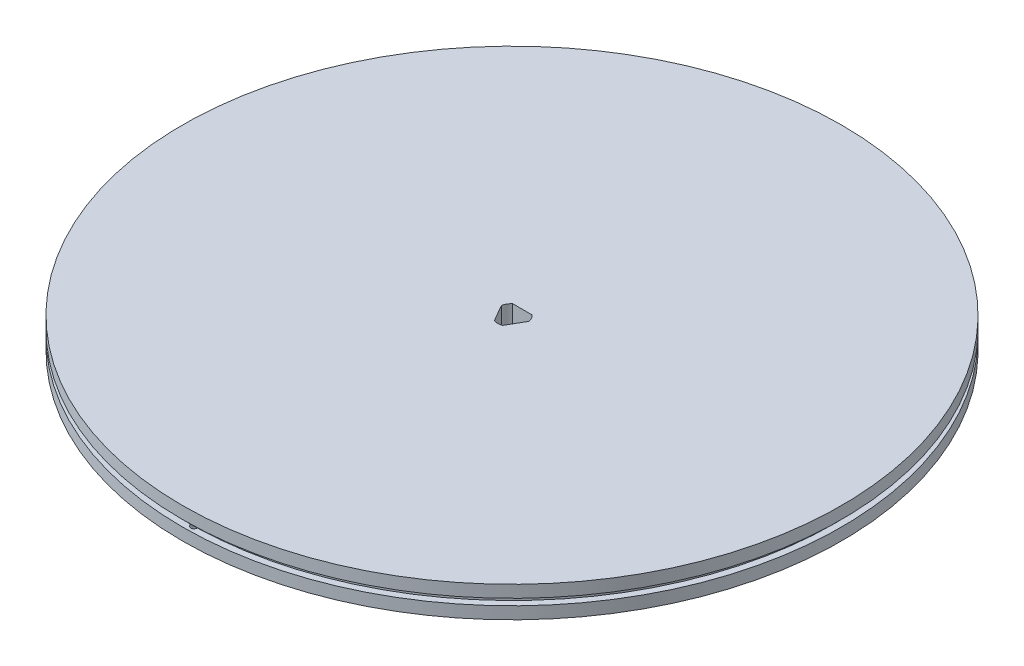
ISO-10303-21;
HEADER;
FILE_DESCRIPTION(('STEP AP214'),'2;1');
FILE_NAME('part.step','',(''),(''),'','','');
FILE_SCHEMA(('AUTOMOTIVE_DESIGN { 1 0 10303 214 1 1 1 1 }'));
ENDSEC;
DATA;
#1=APPLICATION_CONTEXT('core data for automotive mechanical design processes');
#2=APPLICATION_PROTOCOL_DEFINITION('international standard','automotive_design',2000,#1);
#3=PRODUCT_CONTEXT('',#1,'mechanical');
#4=PRODUCT('Part','Part','',(#3));
#5=PRODUCT_RELATED_PRODUCT_CATEGORY('part','',(#4));
#6=PRODUCT_DEFINITION_FORMATION('','',#4);
#7=PRODUCT_DEFINITION_CONTEXT('part definition',#1,'design');
#8=PRODUCT_DEFINITION('design','',#6,#7);
#9=PRODUCT_DEFINITION_SHAPE('','',#8);
#10=(LENGTH_UNIT() NAMED_UNIT(*) SI_UNIT(.MILLI.,.METRE.));
#11=(NAMED_UNIT(*) PLANE_ANGLE_UNIT() SI_UNIT($,.RADIAN.));
#12=(NAMED_UNIT(*) SI_UNIT($,.STERADIAN.) SOLID_ANGLE_UNIT());
#13=UNCERTAINTY_MEASURE_WITH_UNIT(LENGTH_MEASURE(1.E-05),#10,'distance_accuracy_value','');
#14=(GEOMETRIC_REPRESENTATION_CONTEXT(3) GLOBAL_UNCERTAINTY_ASSIGNED_CONTEXT((#13)) GLOBAL_UNIT_ASSIGNED_CONTEXT((#10,
#11,#12)) REPRESENTATION_CONTEXT('',''));
#15=CARTESIAN_POINT('',(0.,0.,0.));
#16=DIRECTION('',(0.,0.,1.));
#17=DIRECTION('',(1.,0.,0.));
#18=AXIS2_PLACEMENT_3D('',#15,#16,#17);
#19=CARTESIAN_POINT('',(0.,2.38125,0.));
#20=DIRECTION('',(0.,-1.,0.));
#21=DIRECTION('',(0.,0.,-1.));
#22=AXIS2_PLACEMENT_3D('',#19,#20,#21);
#23=CYLINDRICAL_SURFACE('',#22,51.);
#24=CARTESIAN_POINT('',(0.,-2.38125,0.));
#25=DIRECTION('',(0.,1.,0.));
#26=DIRECTION('',(0.,0.,1.));
#27=AXIS2_PLACEMENT_3D('',#24,#25,#26);
#28=CIRCLE('',#27,51.);
#29=CARTESIAN_POINT('',(0.,-2.38125,-51.));
#30=VERTEX_POINT('',#29);
#31=EDGE_CURVE('E37',#30,#30,#28,.T.);
#32=CARTESIAN_POINT('',(0.,-0.5,0.));
#33=DIRECTION('',(0.,1.,0.));
#34=DIRECTION('',(0.,0.,1.));
#35=AXIS2_PLACEMENT_3D('',#32,#33,#34);
#36=CIRCLE('',#35,51.);
#37=CARTESIAN_POINT('',(0.,-0.5,-51.));
#38=VERTEX_POINT('',#37);
#39=EDGE_CURVE('E159',#38,#38,#36,.T.);
#40=CARTESIAN_POINT('',(0.,-2.38125,-51.));
#41=CARTESIAN_POINT('',(0.,-2.36165364583333,-51.));
#42=CARTESIAN_POINT('',(0.,-2.34205729166667,-51.));
#43=CARTESIAN_POINT('',(0.,-2.30286458333333,-51.));
#44=CARTESIAN_POINT('',(0.,-2.28326822916667,-51.));
#45=CARTESIAN_POINT('',(0.,-2.24407552083333,-51.));
#46=CARTESIAN_POINT('',(0.,-2.22447916666667,-51.));
#47=CARTESIAN_POINT('',(0.,-2.18528645833333,-51.));
#48=CARTESIAN_POINT('',(0.,-2.16569010416667,-51.));
#49=CARTESIAN_POINT('',(0.,-2.12649739583333,-51.));
#50=CARTESIAN_POINT('',(0.,-2.10690104166667,-51.));
#51=CARTESIAN_POINT('',(0.,-2.06770833333333,-51.));
#52=CARTESIAN_POINT('',(0.,-2.04811197916667,-51.));
#53=CARTESIAN_POINT('',(0.,-2.00891927083333,-51.));
#54=CARTESIAN_POINT('',(0.,-1.98932291666667,-51.));
#55=CARTESIAN_POINT('',(0.,-1.95013020833333,-51.));
#56=CARTESIAN_POINT('',(0.,-1.93053385416667,-51.));
#57=CARTESIAN_POINT('',(0.,-1.89134114583333,-51.));
#58=CARTESIAN_POINT('',(0.,-1.87174479166667,-51.));
#59=CARTESIAN_POINT('',(0.,-1.83255208333333,-51.));
#60=CARTESIAN_POINT('',(0.,-1.81295572916667,-51.));
#61=CARTESIAN_POINT('',(0.,-1.77376302083333,-51.));
#62=CARTESIAN_POINT('',(0.,-1.75416666666667,-51.));
#63=CARTESIAN_POINT('',(0.,-1.71497395833333,-51.));
#64=CARTESIAN_POINT('',(0.,-1.69537760416667,-51.));
#65=CARTESIAN_POINT('',(0.,-1.65618489583333,-51.));
#66=CARTESIAN_POINT('',(0.,-1.63658854166667,-51.));
#67=CARTESIAN_POINT('',(0.,-1.59739583333333,-51.));
#68=CARTESIAN_POINT('',(0.,-1.57779947916667,-51.));
#69=CARTESIAN_POINT('',(0.,-1.53860677083333,-51.));
#70=CARTESIAN_POINT('',(0.,-1.51901041666667,-51.));
#71=CARTESIAN_POINT('',(0.,-1.47981770833333,-51.));
#72=CARTESIAN_POINT('',(0.,-1.46022135416667,-51.));
#73=CARTESIAN_POINT('',(0.,-1.42102864583333,-51.));
#74=CARTESIAN_POINT('',(0.,-1.40143229166667,-51.));
#75=CARTESIAN_POINT('',(0.,-1.36223958333333,-51.));
#76=CARTESIAN_POINT('',(0.,-1.34264322916667,-51.));
#77=CARTESIAN_POINT('',(0.,-1.30345052083333,-51.));
#78=CARTESIAN_POINT('',(0.,-1.28385416666667,-51.));
#79=CARTESIAN_POINT('',(0.,-1.24466145833333,-51.));
#80=CARTESIAN_POINT('',(0.,-1.22506510416667,-51.));
#81=CARTESIAN_POINT('',(0.,-1.18587239583333,-51.));
#82=CARTESIAN_POINT('',(0.,-1.16627604166667,-51.));
#83=CARTESIAN_POINT('',(0.,-1.12708333333333,-51.));
#84=CARTESIAN_POINT('',(0.,-1.10748697916667,-51.));
#85=CARTESIAN_POINT('',(0.,-1.06829427083333,-51.));
#86=CARTESIAN_POINT('',(0.,-1.04869791666667,-51.));
#87=CARTESIAN_POINT('',(0.,-1.00950520833333,-51.));
#88=CARTESIAN_POINT('',(0.,-0.989908854166667,-51.));
#89=CARTESIAN_POINT('',(0.,-0.950716145833334,-51.));
#90=CARTESIAN_POINT('',(0.,-0.931119791666667,-51.));
#91=CARTESIAN_POINT('',(0.,-0.891927083333334,-51.));
#92=CARTESIAN_POINT('',(0.,-0.872330729166667,-51.));
#93=CARTESIAN_POINT('',(0.,-0.833138020833334,-51.));
#94=CARTESIAN_POINT('',(0.,-0.813541666666667,-51.));
#95=CARTESIAN_POINT('',(0.,-0.774348958333334,-51.));
#96=CARTESIAN_POINT('',(0.,-0.754752604166667,-51.));
#97=CARTESIAN_POINT('',(0.,-0.715559895833334,-51.));
#98=CARTESIAN_POINT('',(0.,-0.695963541666667,-51.));
#99=CARTESIAN_POINT('',(0.,-0.656770833333334,-51.));
#100=CARTESIAN_POINT('',(0.,-0.637174479166667,-51.));
#101=CARTESIAN_POINT('',(0.,-0.597981770833334,-51.));
#102=CARTESIAN_POINT('',(0.,-0.578385416666667,-51.));
#103=CARTESIAN_POINT('',(0.,-0.539192708333334,-51.));
#104=CARTESIAN_POINT('',(0.,-0.519596354166667,-51.));
#105=CARTESIAN_POINT('',(0.,-0.5,-51.));
#106=B_SPLINE_CURVE_WITH_KNOTS('',3,(#40,#41,#42,#43,#44,#45,#46,#47,#48,#49,#50,#51,#52,#53,
#54,#55,#56,#57,#58,#59,#60,#61,#62,#63,#64,#65,#66,#67,#68,#69,#70,#71,#72,#73,#74,#75,#76,#77,
#78,#79,#80,#81,#82,#83,#84,#85,#86,#87,#88,#89,#90,#91,#92,#93,#94,#95,#96,#97,#98,#99,#100,
#101,#102,#103,#104,#105),.UNSPECIFIED.,.F.,.F.,(4,2,2,2,2,2,2,2,2,2,2,2,2,2,2,2,2,2,2,2,2,2,2,
2,2,2,2,2,2,2,2,2,4),(0.,0.0587890625,0.117578125,0.1763671875,0.23515625,0.2939453125,
0.352734375,0.4115234375,0.4703125,0.5291015625,0.587890625,0.6466796875,0.70546875,
0.7642578125,0.823046875,0.8818359375,0.940625,0.9994140625,1.058203125,1.1169921875,1.17578125,
1.2345703125,1.293359375,1.3521484375,1.4109375,1.4697265625,1.528515625,1.5873046875,
1.64609375,1.7048828125,1.763671875,1.8224609375,1.88125),.UNSPECIFIED.);
#107=EDGE_CURVE('BSEAM33',#30,#38,#106,.T.);
#108=ORIENTED_EDGE('',*,*,#31,.T.);
#109=ORIENTED_EDGE('',*,*,#39,.F.);
#110=ORIENTED_EDGE('',*,*,#107,.T.);
#111=ORIENTED_EDGE('',*,*,#107,.F.);
#112=EDGE_LOOP('',(#108,#110,#109,#111));
#113=FACE_BOUND('',#112,.T.);
#114=ADVANCED_FACE('F33',(#113),#23,.T.);
#115=CARTESIAN_POINT('',(0.,-2.38125,0.));
#116=DIRECTION('',(0.,1.,0.));
#117=DIRECTION('',(0.,0.,1.));
#118=AXIS2_PLACEMENT_3D('',#115,#116,#117);
#119=PLANE('',#118);
#120=DIRECTION('',(-1.,0.,0.));
#121=VECTOR('',#120,1.);
#122=CARTESIAN_POINT('',(1.50996688705415,-2.38125,-1.6));
#123=LINE('',#122,#121);
#124=CARTESIAN_POINT('',(1.50996688705415,-2.38125,-1.6));
#125=VERTEX_POINT('',#124);
#126=CARTESIAN_POINT('',(-1.50996688705415,-2.38125,-1.6));
#127=VERTEX_POINT('',#126);
#128=EDGE_CURVE('E100',#125,#127,#123,.T.);
#129=ORIENTED_EDGE('',*,*,#128,.T.);
#130=CARTESIAN_POINT('',(0.,-2.38125,0.));
#131=DIRECTION('',(0.,1.,0.));
#132=DIRECTION('',(0.,0.,1.));
#133=AXIS2_PLACEMENT_3D('',#130,#131,#132);
#134=CIRCLE('',#133,2.2);
#135=CARTESIAN_POINT('',(-2.14062408958218,-2.38125,-0.507669683062202));
#136=VERTEX_POINT('',#135);
#137=EDGE_CURVE('E94',#127,#136,#134,.T.);
#138=ORIENTED_EDGE('',*,*,#137,.T.);
#139=DIRECTION('',(0.499999999999999,0.,0.866025403784439));
#140=VECTOR('',#139,1.);
#141=CARTESIAN_POINT('',(-2.14062408958218,-2.38125,-0.507669683062202));
#142=LINE('',#141,#140);
#143=CARTESIAN_POINT('',(-0.630657202528029,-2.38125,2.1076696830622));
#144=VERTEX_POINT('',#143);
#145=EDGE_CURVE('E103',#136,#144,#142,.T.);
#146=ORIENTED_EDGE('',*,*,#145,.T.);
#147=CARTESIAN_POINT('',(0.,-2.38125,0.));
#148=DIRECTION('',(0.,1.,0.));
#149=DIRECTION('',(0.,0.,1.));
#150=AXIS2_PLACEMENT_3D('',#147,#148,#149);
#151=CIRCLE('',#150,2.2);
#152=CARTESIAN_POINT('',(0.630657202528029,-2.38125,2.1076696830622));
#153=VERTEX_POINT('',#152);
#154=EDGE_CURVE('E48',#144,#153,#151,.T.);
#155=ORIENTED_EDGE('',*,*,#154,.T.);
#156=DIRECTION('',(0.5,0.,-0.866025403784439));
#157=VECTOR('',#156,1.);
#158=CARTESIAN_POINT('',(0.630657202528029,-2.38125,2.1076696830622));
#159=LINE('',#158,#157);
#160=CARTESIAN_POINT('',(2.14062408958218,-2.38125,-0.5076696830622));
#161=VERTEX_POINT('',#160);
#162=EDGE_CURVE('E118',#153,#161,#159,.T.);
#163=ORIENTED_EDGE('',*,*,#162,.T.);
#164=CARTESIAN_POINT('',(0.,-2.38125,0.));
#165=DIRECTION('',(0.,1.,0.));
#166=DIRECTION('',(0.,0.,-1.));
#167=AXIS2_PLACEMENT_3D('',#164,#165,#166);
#168=CIRCLE('',#167,2.2);
#169=EDGE_CURVE('E121',#161,#125,#168,.T.);
#170=ORIENTED_EDGE('',*,*,#169,.T.);
#171=EDGE_LOOP('',(#129,#138,#146,#155,#163,#170));
#172=FACE_BOUND('',#171,.T.);
#173=CARTESIAN_POINT('',(0.78950429278192,-2.38125,50.));
#174=DIRECTION('',(0.,1.,0.));
#175=DIRECTION('',(0.,0.,1.));
#176=AXIS2_PLACEMENT_3D('',#173,#174,#175);
#177=CIRCLE('',#176,0.5);
#178=CARTESIAN_POINT('',(0.78950429278192,-2.38125,50.5));
#179=VERTEX_POINT('',#178);
#180=EDGE_CURVE('E148',#179,#179,#177,.F.);
#181=ORIENTED_EDGE('',*,*,#180,.F.);
#182=EDGE_LOOP('',(#181));
#183=FACE_BOUND('',#182,.T.);
#184=ORIENTED_EDGE('',*,*,#31,.F.);
#185=EDGE_LOOP('',(#184));
#186=FACE_BOUND('',#185,.T.);
#187=ADVANCED_FACE('F107',(#172,#183,#186),#119,.F.);
#188=CARTESIAN_POINT('',(0.,-0.5,0.));
#189=DIRECTION('',(0.,1.,0.));
#190=DIRECTION('',(0.,0.,1.));
#191=AXIS2_PLACEMENT_3D('',#188,#189,#190);
#192=PLANE('',#191);
#193=CARTESIAN_POINT('',(0.78950429278192,-0.5,50.));
#194=DIRECTION('',(0.,1.,0.));
#195=DIRECTION('',(0.,0.,1.));
#196=AXIS2_PLACEMENT_3D('',#193,#194,#195);
#197=CIRCLE('',#196,0.5);
#198=CARTESIAN_POINT('',(0.28950499525847,-0.5,49.9991618615524));
#199=VERTEX_POINT('',#198);
#200=CARTESIAN_POINT('',(1.28922786403419,-0.5,49.9833761516226));
#201=VERTEX_POINT('',#200);
#202=EDGE_CURVE('E137',#199,#201,#197,.T.);
#203=ORIENTED_EDGE('',*,*,#202,.F.);
#204=CARTESIAN_POINT('',(0.,-0.5,0.));
#205=DIRECTION('',(0.,1.,0.));
#206=DIRECTION('',(0.,0.,1.));
#207=AXIS2_PLACEMENT_3D('',#204,#205,#206);
#208=CIRCLE('',#207,50.);
#209=EDGE_CURVE('E156',#201,#199,#208,.T.);
#210=ORIENTED_EDGE('',*,*,#209,.F.);
#211=EDGE_LOOP('',(#203,#210));
#212=FACE_BOUND('',#211,.T.);
#213=ORIENTED_EDGE('',*,*,#39,.T.);
#214=EDGE_LOOP('',(#213));
#215=FACE_BOUND('',#214,.T.);
#216=ADVANCED_FACE('F170',(#212,#215),#192,.T.);
#217=CARTESIAN_POINT('',(0.,0.5,0.));
#218=DIRECTION('',(0.,1.,0.));
#219=DIRECTION('',(0.,0.,1.));
#220=AXIS2_PLACEMENT_3D('',#217,#218,#219);
#221=PLANE('',#220);
#222=CARTESIAN_POINT('',(0.,0.5,0.));
#223=DIRECTION('',(0.,1.,0.));
#224=DIRECTION('',(0.,0.,1.));
#225=AXIS2_PLACEMENT_3D('',#222,#223,#224);
#226=CIRCLE('',#225,50.);
#227=CARTESIAN_POINT('',(0.,0.5,50.));
#228=VERTEX_POINT('',#227);
#229=EDGE_CURVE('E151',#228,#228,#226,.T.);
#230=ORIENTED_EDGE('',*,*,#229,.T.);
#231=EDGE_LOOP('',(#230));
#232=FACE_BOUND('',#231,.T.);
#233=CARTESIAN_POINT('',(0.,0.5,0.));
#234=DIRECTION('',(0.,1.,0.));
#235=DIRECTION('',(0.,0.,1.));
#236=AXIS2_PLACEMENT_3D('',#233,#234,#235);
#237=CIRCLE('',#236,51.);
#238=CARTESIAN_POINT('',(0.,0.5,-51.));
#239=VERTEX_POINT('',#238);
#240=EDGE_CURVE('E155',#239,#239,#237,.T.);
#241=ORIENTED_EDGE('',*,*,#240,.F.);
#242=EDGE_LOOP('',(#241));
#243=FACE_BOUND('',#242,.T.);
#244=ADVANCED_FACE('F167',(#232,#243),#221,.F.);
#245=CARTESIAN_POINT('',(0.,-0.5,0.));
#246=DIRECTION('',(0.,1.,0.));
#247=DIRECTION('',(0.,0.,1.));
#248=AXIS2_PLACEMENT_3D('',#245,#246,#247);
#249=CYLINDRICAL_SURFACE('',#248,50.);
#250=EDGE_CURVE('E152',#199,#201,#208,.T.);
#251=ORIENTED_EDGE('',*,*,#250,.T.);
#252=ORIENTED_EDGE('',*,*,#209,.T.);
#253=EDGE_LOOP('',(#251,#252));
#254=FACE_BOUND('',#253,.T.);
#255=ORIENTED_EDGE('',*,*,#229,.F.);
#256=EDGE_LOOP('',(#255));
#257=FACE_BOUND('',#256,.T.);
#258=ADVANCED_FACE('F169',(#254,#257),#249,.T.);
#259=CARTESIAN_POINT('',(0.,2.38125,0.));
#260=DIRECTION('',(0.,1.,0.));
#261=DIRECTION('',(0.,0.,1.));
#262=AXIS2_PLACEMENT_3D('',#259,#260,#261);
#263=PLANE('',#262);
#264=CARTESIAN_POINT('',(0.,2.38125,0.));
#265=DIRECTION('',(0.,1.,0.));
#266=DIRECTION('',(0.,0.,1.));
#267=AXIS2_PLACEMENT_3D('',#264,#265,#266);
#268=CIRCLE('',#267,2.2);
#269=CARTESIAN_POINT('',(-1.50996688705415,2.38125,-1.6));
#270=VERTEX_POINT('',#269);
#271=CARTESIAN_POINT('',(-2.14062408958218,2.38125,-0.507669683062202));
#272=VERTEX_POINT('',#271);
#273=EDGE_CURVE('E56',#270,#272,#268,.T.);
#274=ORIENTED_EDGE('',*,*,#273,.F.);
#275=DIRECTION('',(-1.,0.,0.));
#276=VECTOR('',#275,1.);
#277=CARTESIAN_POINT('',(1.50996688705415,2.38125,-1.6));
#278=LINE('',#277,#276);
#279=CARTESIAN_POINT('',(1.50996688705415,2.38125,-1.6));
#280=VERTEX_POINT('',#279);
#281=EDGE_CURVE('E111',#280,#270,#278,.T.);
#282=ORIENTED_EDGE('',*,*,#281,.F.);
#283=CARTESIAN_POINT('',(0.,2.38125,0.));
#284=DIRECTION('',(0.,1.,0.));
#285=DIRECTION('',(0.,0.,-1.));
#286=AXIS2_PLACEMENT_3D('',#283,#284,#285);
#287=CIRCLE('',#286,2.2);
#288=CARTESIAN_POINT('',(2.14062408958218,2.38125,-0.5076696830622));
#289=VERTEX_POINT('',#288);
#290=EDGE_CURVE('E114',#289,#280,#287,.T.);
#291=ORIENTED_EDGE('',*,*,#290,.F.);
#292=DIRECTION('',(0.5,0.,-0.866025403784439));
#293=VECTOR('',#292,1.);
#294=CARTESIAN_POINT('',(0.630657202528029,2.38125,2.1076696830622));
#295=LINE('',#294,#293);
#296=CARTESIAN_POINT('',(0.630657202528029,2.38125,2.1076696830622));
#297=VERTEX_POINT('',#296);
#298=EDGE_CURVE('E130',#297,#289,#295,.T.);
#299=ORIENTED_EDGE('',*,*,#298,.F.);
#300=CARTESIAN_POINT('',(0.,2.38125,0.));
#301=DIRECTION('',(0.,1.,0.));
#302=DIRECTION('',(0.,0.,1.));
#303=AXIS2_PLACEMENT_3D('',#300,#301,#302);
#304=CIRCLE('',#303,2.2);
#305=CARTESIAN_POINT('',(-0.63065720252803,2.38125,2.1076696830622));
#306=VERTEX_POINT('',#305);
#307=EDGE_CURVE('E127',#306,#297,#304,.T.);
#308=ORIENTED_EDGE('',*,*,#307,.F.);
#309=DIRECTION('',(0.499999999999999,0.,0.866025403784439));
#310=VECTOR('',#309,1.);
#311=CARTESIAN_POINT('',(-2.14062408958218,2.38125,-0.507669683062202));
#312=LINE('',#311,#310);
#313=EDGE_CURVE('E125',#272,#306,#312,.T.);
#314=ORIENTED_EDGE('',*,*,#313,.F.);
#315=EDGE_LOOP('',(#274,#282,#291,#299,#308,#314));
#316=FACE_BOUND('',#315,.T.);
#317=CARTESIAN_POINT('',(0.,2.38125,0.));
#318=DIRECTION('',(0.,1.,0.));
#319=DIRECTION('',(0.,0.,1.));
#320=AXIS2_PLACEMENT_3D('',#317,#318,#319);
#321=CIRCLE('',#320,51.);
#322=CARTESIAN_POINT('',(0.,2.38125,-51.));
#323=VERTEX_POINT('',#322);
#324=EDGE_CURVE('E11',#323,#323,#321,.T.);
#325=ORIENTED_EDGE('',*,*,#324,.T.);
#326=EDGE_LOOP('',(#325));
#327=FACE_BOUND('',#326,.T.);
#328=ADVANCED_FACE('F177',(#316,#327),#263,.T.);
#329=CARTESIAN_POINT('',(0.,0.5,-51.));
#330=CARTESIAN_POINT('',(0.,0.519596354166666,-51.));
#331=CARTESIAN_POINT('',(0.,0.539192708333333,-51.));
#332=CARTESIAN_POINT('',(0.,0.578385416666667,-51.));
#333=CARTESIAN_POINT('',(0.,0.597981770833333,-51.));
#334=CARTESIAN_POINT('',(0.,0.637174479166667,-51.));
#335=CARTESIAN_POINT('',(0.,0.656770833333333,-51.));
#336=CARTESIAN_POINT('',(0.,0.695963541666667,-51.));
#337=CARTESIAN_POINT('',(0.,0.715559895833333,-51.));
#338=CARTESIAN_POINT('',(0.,0.754752604166667,-51.));
#339=CARTESIAN_POINT('',(0.,0.774348958333333,-51.));
#340=CARTESIAN_POINT('',(0.,0.813541666666667,-51.));
#341=CARTESIAN_POINT('',(0.,0.833138020833333,-51.));
#342=CARTESIAN_POINT('',(0.,0.872330729166667,-51.));
#343=CARTESIAN_POINT('',(0.,0.891927083333333,-51.));
#344=CARTESIAN_POINT('',(0.,0.931119791666666,-51.));
#345=CARTESIAN_POINT('',(0.,0.950716145833333,-51.));
#346=CARTESIAN_POINT('',(0.,0.989908854166667,-51.));
#347=CARTESIAN_POINT('',(0.,1.00950520833333,-51.));
#348=CARTESIAN_POINT('',(0.,1.04869791666667,-51.));
#349=CARTESIAN_POINT('',(0.,1.06829427083333,-51.));
#350=CARTESIAN_POINT('',(0.,1.10748697916667,-51.));
#351=CARTESIAN_POINT('',(0.,1.12708333333333,-51.));
#352=CARTESIAN_POINT('',(0.,1.16627604166667,-51.));
#353=CARTESIAN_POINT('',(0.,1.18587239583333,-51.));
#354=CARTESIAN_POINT('',(0.,1.22506510416667,-51.));
#355=CARTESIAN_POINT('',(0.,1.24466145833333,-51.));
#356=CARTESIAN_POINT('',(0.,1.28385416666667,-51.));
#357=CARTESIAN_POINT('',(0.,1.30345052083333,-51.));
#358=CARTESIAN_POINT('',(0.,1.34264322916667,-51.));
#359=CARTESIAN_POINT('',(0.,1.36223958333333,-51.));
#360=CARTESIAN_POINT('',(0.,1.40143229166667,-51.));
#361=CARTESIAN_POINT('',(0.,1.42102864583333,-51.));
#362=CARTESIAN_POINT('',(0.,1.46022135416667,-51.));
#363=CARTESIAN_POINT('',(0.,1.47981770833333,-51.));
#364=CARTESIAN_POINT('',(0.,1.51901041666667,-51.));
#365=CARTESIAN_POINT('',(0.,1.53860677083333,-51.));
#366=CARTESIAN_POINT('',(0.,1.57779947916667,-51.));
#367=CARTESIAN_POINT('',(0.,1.59739583333333,-51.));
#368=CARTESIAN_POINT('',(0.,1.63658854166667,-51.));
#369=CARTESIAN_POINT('',(0.,1.65618489583333,-51.));
#370=CARTESIAN_POINT('',(0.,1.69537760416667,-51.));
#371=CARTESIAN_POINT('',(0.,1.71497395833333,-51.));
#372=CARTESIAN_POINT('',(0.,1.75416666666667,-51.));
#373=CARTESIAN_POINT('',(0.,1.77376302083333,-51.));
#374=CARTESIAN_POINT('',(0.,1.81295572916667,-51.));
#375=CARTESIAN_POINT('',(0.,1.83255208333333,-51.));
#376=CARTESIAN_POINT('',(0.,1.87174479166667,-51.));
#377=CARTESIAN_POINT('',(0.,1.89134114583333,-51.));
#378=CARTESIAN_POINT('',(0.,1.93053385416667,-51.));
#379=CARTESIAN_POINT('',(0.,1.95013020833333,-51.));
#380=CARTESIAN_POINT('',(0.,1.98932291666667,-51.));
#381=CARTESIAN_POINT('',(0.,2.00891927083333,-51.));
#382=CARTESIAN_POINT('',(0.,2.04811197916667,-51.));
#383=CARTESIAN_POINT('',(0.,2.06770833333333,-51.));
#384=CARTESIAN_POINT('',(0.,2.10690104166667,-51.));
#385=CARTESIAN_POINT('',(0.,2.12649739583333,-51.));
#386=CARTESIAN_POINT('',(0.,2.16569010416667,-51.));
#387=CARTESIAN_POINT('',(0.,2.18528645833333,-51.));
#388=CARTESIAN_POINT('',(0.,2.22447916666667,-51.));
#389=CARTESIAN_POINT('',(0.,2.24407552083333,-51.));
#390=CARTESIAN_POINT('',(0.,2.28326822916667,-51.));
#391=CARTESIAN_POINT('',(0.,2.30286458333333,-51.));
#392=CARTESIAN_POINT('',(0.,2.34205729166667,-51.));
#393=CARTESIAN_POINT('',(0.,2.36165364583333,-51.));
#394=CARTESIAN_POINT('',(0.,2.38125,-51.));
#395=B_SPLINE_CURVE_WITH_KNOTS('',3,(#329,#330,#331,#332,#333,#334,#335,#336,#337,#338,#339,
#340,#341,#342,#343,#344,#345,#346,#347,#348,#349,#350,#351,#352,#353,#354,#355,#356,#357,#358,
#359,#360,#361,#362,#363,#364,#365,#366,#367,#368,#369,#370,#371,#372,#373,#374,#375,#376,#377,
#378,#379,#380,#381,#382,#383,#384,#385,#386,#387,#388,#389,#390,#391,#392,#393,#394),
.UNSPECIFIED.,.F.,.F.,(4,2,2,2,2,2,2,2,2,2,2,2,2,2,2,2,2,2,2,2,2,2,2,2,2,2,2,2,2,2,2,2,4),(0.,
0.0587890625,0.117578125,0.1763671875,0.23515625,0.2939453125,0.352734375,0.4115234375,
0.4703125,0.5291015625,0.587890625,0.6466796875,0.70546875,0.7642578125,0.823046875,
0.8818359375,0.940625,0.9994140625,1.058203125,1.1169921875,1.17578125,1.2345703125,1.293359375,
1.3521484375,1.4109375,1.4697265625,1.528515625,1.5873046875,1.64609375,1.7048828125,
1.763671875,1.8224609375,1.88125),.UNSPECIFIED.);
#396=EDGE_CURVE('BSEAM35',#239,#323,#395,.T.);
#397=ORIENTED_EDGE('',*,*,#240,.T.);
#398=ORIENTED_EDGE('',*,*,#324,.F.);
#399=ORIENTED_EDGE('',*,*,#396,.T.);
#400=ORIENTED_EDGE('',*,*,#396,.F.);
#401=EDGE_LOOP('',(#397,#399,#398,#400));
#402=FACE_BOUND('',#401,.T.);
#403=ADVANCED_FACE('F35',(#402),#23,.T.);
#404=CARTESIAN_POINT('',(0.78950429278192,-3.7954635623731,50.));
#405=DIRECTION('',(0.,1.,0.));
#406=DIRECTION('',(0.,0.,1.));
#407=AXIS2_PLACEMENT_3D('',#404,#405,#406);
#408=CYLINDRICAL_SURFACE('',#407,0.5);
#409=ORIENTED_EDGE('',*,*,#180,.T.);
#410=EDGE_LOOP('',(#409));
#411=FACE_BOUND('',#410,.T.);
#412=EDGE_CURVE('E145',#201,#199,#197,.T.);
#413=ORIENTED_EDGE('',*,*,#412,.T.);
#414=ORIENTED_EDGE('',*,*,#202,.T.);
#415=EDGE_LOOP('',(#413,#414));
#416=FACE_BOUND('',#415,.T.);
#417=ADVANCED_FACE('F191',(#411,#416),#408,.F.);
#418=CARTESIAN_POINT('',(0.78950429278192,-0.5,50.));
#419=DIRECTION('',(0.,1.,0.));
#420=DIRECTION('',(0.,0.,1.));
#421=AXIS2_PLACEMENT_3D('',#418,#419,#420);
#422=PLANE('',#421);
#423=ORIENTED_EDGE('',*,*,#250,.F.);
#424=ORIENTED_EDGE('',*,*,#412,.F.);
#425=EDGE_LOOP('',(#423,#424));
#426=FACE_BOUND('',#425,.T.);
#427=ADVANCED_FACE('F196',(#426),#422,.F.);
#428=CARTESIAN_POINT('',(0.,-2.38125,0.));
#429=DIRECTION('',(0.,1.,0.));
#430=DIRECTION('',(0.,0.,1.));
#431=AXIS2_PLACEMENT_3D('',#428,#429,#430);
#432=CYLINDRICAL_SURFACE('',#431,2.2);
#433=ORIENTED_EDGE('',*,*,#273,.T.);
#434=DIRECTION('',(0.,1.,0.));
#435=VECTOR('',#434,1.);
#436=CARTESIAN_POINT('',(-2.14062408958218,-2.38125,-0.507669683062202));
#437=LINE('',#436,#435);
#438=EDGE_CURVE('E90',#136,#272,#437,.T.);
#439=ORIENTED_EDGE('',*,*,#438,.F.);
#440=ORIENTED_EDGE('',*,*,#137,.F.);
#441=DIRECTION('',(0.,1.,0.));
#442=VECTOR('',#441,1.);
#443=CARTESIAN_POINT('',(-1.50996688705415,-2.38125,-1.6));
#444=LINE('',#443,#442);
#445=EDGE_CURVE('E135',#127,#270,#444,.T.);
#446=ORIENTED_EDGE('',*,*,#445,.T.);
#447=EDGE_LOOP('',(#433,#439,#440,#446));
#448=FACE_BOUND('',#447,.T.);
#449=ADVANCED_FACE('F92',(#448),#432,.F.);
#450=CARTESIAN_POINT('',(1.50996688705415,-2.38125,-1.6));
#451=DIRECTION('',(0.,0.,-1.));
#452=DIRECTION('',(-1.,0.,0.));
#453=AXIS2_PLACEMENT_3D('',#450,#451,#452);
#454=PLANE('',#453);
#455=ORIENTED_EDGE('',*,*,#281,.T.);
#456=ORIENTED_EDGE('',*,*,#445,.F.);
#457=ORIENTED_EDGE('',*,*,#128,.F.);
#458=DIRECTION('',(0.,1.,0.));
#459=VECTOR('',#458,1.);
#460=CARTESIAN_POINT('',(1.50996688705415,-2.38125,-1.6));
#461=LINE('',#460,#459);
#462=EDGE_CURVE('E138',#125,#280,#461,.T.);
#463=ORIENTED_EDGE('',*,*,#462,.T.);
#464=EDGE_LOOP('',(#455,#456,#457,#463));
#465=FACE_BOUND('',#464,.T.);
#466=ADVANCED_FACE('F216',(#465),#454,.F.);
#467=CARTESIAN_POINT('',(0.,-2.38125,0.));
#468=DIRECTION('',(0.,1.,0.));
#469=DIRECTION('',(0.,0.,1.));
#470=AXIS2_PLACEMENT_3D('',#467,#468,#469);
#471=CYLINDRICAL_SURFACE('',#470,2.2);
#472=ORIENTED_EDGE('',*,*,#290,.T.);
#473=ORIENTED_EDGE('',*,*,#462,.F.);
#474=ORIENTED_EDGE('',*,*,#169,.F.);
#475=DIRECTION('',(0.,1.,0.));
#476=VECTOR('',#475,1.);
#477=CARTESIAN_POINT('',(2.14062408958218,-2.38125,-0.5076696830622));
#478=LINE('',#477,#476);
#479=EDGE_CURVE('E140',#161,#289,#478,.T.);
#480=ORIENTED_EDGE('',*,*,#479,.T.);
#481=EDGE_LOOP('',(#472,#473,#474,#480));
#482=FACE_BOUND('',#481,.T.);
#483=ADVANCED_FACE('F214',(#482),#471,.F.);
#484=CARTESIAN_POINT('',(0.630657202528029,-2.38125,2.1076696830622));
#485=DIRECTION('',(0.866025403784439,0.,0.5));
#486=DIRECTION('',(0.5,0.,-0.866025403784439));
#487=AXIS2_PLACEMENT_3D('',#484,#485,#486);
#488=PLANE('',#487);
#489=ORIENTED_EDGE('',*,*,#298,.T.);
#490=ORIENTED_EDGE('',*,*,#479,.F.);
#491=ORIENTED_EDGE('',*,*,#162,.F.);
#492=DIRECTION('',(0.,1.,0.));
#493=VECTOR('',#492,1.);
#494=CARTESIAN_POINT('',(0.630657202528029,-2.38125,2.1076696830622));
#495=LINE('',#494,#493);
#496=EDGE_CURVE('E142',#153,#297,#495,.T.);
#497=ORIENTED_EDGE('',*,*,#496,.T.);
#498=EDGE_LOOP('',(#489,#490,#491,#497));
#499=FACE_BOUND('',#498,.T.);
#500=ADVANCED_FACE('F211',(#499),#488,.F.);
#501=CARTESIAN_POINT('',(0.,-2.38125,0.));
#502=DIRECTION('',(0.,1.,0.));
#503=DIRECTION('',(0.,0.,1.));
#504=AXIS2_PLACEMENT_3D('',#501,#502,#503);
#505=CYLINDRICAL_SURFACE('',#504,2.2);
#506=ORIENTED_EDGE('',*,*,#307,.T.);
#507=ORIENTED_EDGE('',*,*,#496,.F.);
#508=ORIENTED_EDGE('',*,*,#154,.F.);
#509=DIRECTION('',(0.,1.,0.));
#510=VECTOR('',#509,1.);
#511=CARTESIAN_POINT('',(-0.63065720252803,-2.38125,2.1076696830622));
#512=LINE('',#511,#510);
#513=EDGE_CURVE('E99',#144,#306,#512,.T.);
#514=ORIENTED_EDGE('',*,*,#513,.T.);
#515=EDGE_LOOP('',(#506,#507,#508,#514));
#516=FACE_BOUND('',#515,.T.);
#517=ADVANCED_FACE('F208',(#516),#505,.F.);
#518=CARTESIAN_POINT('',(-2.14062408958218,-2.38125,-0.507669683062202));
#519=DIRECTION('',(-0.866025403784439,0.,0.499999999999999));
#520=DIRECTION('',(0.499999999999999,0.,0.866025403784439));
#521=AXIS2_PLACEMENT_3D('',#518,#519,#520);
#522=PLANE('',#521);
#523=ORIENTED_EDGE('',*,*,#313,.T.);
#524=ORIENTED_EDGE('',*,*,#513,.F.);
#525=ORIENTED_EDGE('',*,*,#145,.F.);
#526=ORIENTED_EDGE('',*,*,#438,.T.);
#527=EDGE_LOOP('',(#523,#524,#525,#526));
#528=FACE_BOUND('',#527,.T.);
#529=ADVANCED_FACE('F104',(#528),#522,.F.);
#530=CLOSED_SHELL('',(#114,#187,#216,#244,#258,#328,#403,#417,#427,#449,#466,#483,#500,#517,#529));
#531=MANIFOLD_SOLID_BREP('B2',#530);
#532=ADVANCED_BREP_SHAPE_REPRESENTATION('',(#18,#531),#14);
#533=SHAPE_DEFINITION_REPRESENTATION(#9,#532);
ENDSEC;
END-ISO-10303-21;
